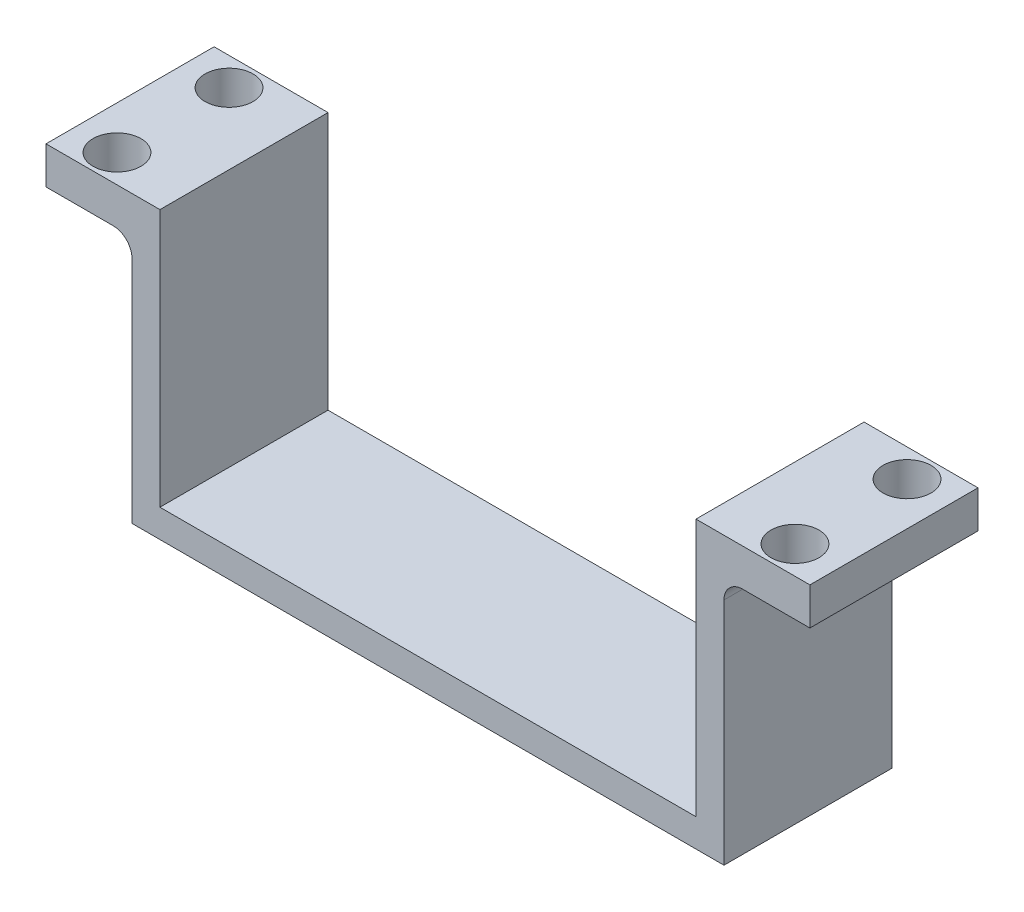
ISO-10303-21;
HEADER;
FILE_DESCRIPTION(('STEP AP214'),'2;1');
FILE_NAME('part.step','',(''),(''),'','','');
FILE_SCHEMA(('AUTOMOTIVE_DESIGN { 1 0 10303 214 1 1 1 1 }'));
ENDSEC;
DATA;
#1=APPLICATION_CONTEXT('core data for automotive mechanical design processes');
#2=APPLICATION_PROTOCOL_DEFINITION('international standard','automotive_design',2000,#1);
#3=PRODUCT_CONTEXT('',#1,'mechanical');
#4=PRODUCT('Part','Part','',(#3));
#5=PRODUCT_RELATED_PRODUCT_CATEGORY('part','',(#4));
#6=PRODUCT_DEFINITION_FORMATION('','',#4);
#7=PRODUCT_DEFINITION_CONTEXT('part definition',#1,'design');
#8=PRODUCT_DEFINITION('design','',#6,#7);
#9=PRODUCT_DEFINITION_SHAPE('','',#8);
#10=(LENGTH_UNIT() NAMED_UNIT(*) SI_UNIT(.MILLI.,.METRE.));
#11=(NAMED_UNIT(*) PLANE_ANGLE_UNIT() SI_UNIT($,.RADIAN.));
#12=(NAMED_UNIT(*) SI_UNIT($,.STERADIAN.) SOLID_ANGLE_UNIT());
#13=UNCERTAINTY_MEASURE_WITH_UNIT(LENGTH_MEASURE(1.E-05),#10,'distance_accuracy_value','');
#14=(GEOMETRIC_REPRESENTATION_CONTEXT(3) GLOBAL_UNCERTAINTY_ASSIGNED_CONTEXT((#13)) GLOBAL_UNIT_ASSIGNED_CONTEXT((#10,
#11,#12)) REPRESENTATION_CONTEXT('',''));
#15=CARTESIAN_POINT('',(0.,0.,0.));
#16=DIRECTION('',(0.,0.,1.));
#17=DIRECTION('',(1.,0.,0.));
#18=AXIS2_PLACEMENT_3D('',#15,#16,#17);
#19=CARTESIAN_POINT('',(-3.81,0.,22.86));
#20=DIRECTION('',(0.,-1.,0.));
#21=DIRECTION('',(0.,0.,-1.));
#22=AXIS2_PLACEMENT_3D('',#19,#20,#21);
#23=PLANE('',#22);
#24=DIRECTION('',(-1.,0.,0.));
#25=VECTOR('',#24,1.);
#26=CARTESIAN_POINT('',(-3.81,0.,0.));
#27=LINE('',#26,#25);
#28=CARTESIAN_POINT('',(0.,0.,0.));
#29=VERTEX_POINT('',#28);
#30=CARTESIAN_POINT('',(-15.494,0.,0.));
#31=VERTEX_POINT('',#30);
#32=EDGE_CURVE('E217',#29,#31,#27,.T.);
#33=ORIENTED_EDGE('',*,*,#32,.T.);
#34=DIRECTION('',(0.,0.,1.));
#35=VECTOR('',#34,1.);
#36=CARTESIAN_POINT('',(-15.494,0.,0.));
#37=LINE('',#36,#35);
#38=CARTESIAN_POINT('',(-15.494,0.,22.86));
#39=VERTEX_POINT('',#38);
#40=EDGE_CURVE('E195',#31,#39,#37,.T.);
#41=ORIENTED_EDGE('',*,*,#40,.T.);
#42=DIRECTION('',(-1.,0.,0.));
#43=VECTOR('',#42,1.);
#44=CARTESIAN_POINT('',(-3.81,0.,22.86));
#45=LINE('',#44,#43);
#46=CARTESIAN_POINT('',(0.,0.,22.86));
#47=VERTEX_POINT('',#46);
#48=EDGE_CURVE('E221',#47,#39,#45,.T.);
#49=ORIENTED_EDGE('',*,*,#48,.F.);
#50=DIRECTION('',(0.,0.,-1.));
#51=VECTOR('',#50,1.);
#52=CARTESIAN_POINT('',(0.,0.,22.86));
#53=LINE('',#52,#51);
#54=EDGE_CURVE('E246',#47,#29,#53,.T.);
#55=ORIENTED_EDGE('',*,*,#54,.T.);
#56=EDGE_LOOP('',(#33,#41,#49,#55));
#57=FACE_BOUND('',#56,.T.);
#58=CARTESIAN_POINT('',(-9.652,0.,19.05));
#59=DIRECTION('',(0.,1.,0.));
#60=DIRECTION('',(0.,0.,1.));
#61=AXIS2_PLACEMENT_3D('',#58,#59,#60);
#62=CIRCLE('',#61,3.26390000000001);
#63=CARTESIAN_POINT('',(-9.652,0.,22.3139));
#64=VERTEX_POINT('',#63);
#65=EDGE_CURVE('E181',#64,#64,#62,.T.);
#66=ORIENTED_EDGE('',*,*,#65,.F.);
#67=EDGE_LOOP('',(#66));
#68=FACE_BOUND('',#67,.T.);
#69=CARTESIAN_POINT('',(-9.652,0.,3.81));
#70=DIRECTION('',(0.,1.,0.));
#71=DIRECTION('',(0.,0.,1.));
#72=AXIS2_PLACEMENT_3D('',#69,#70,#71);
#73=CIRCLE('',#72,3.2639);
#74=CARTESIAN_POINT('',(-9.652,0.,7.0739));
#75=VERTEX_POINT('',#74);
#76=EDGE_CURVE('E187',#75,#75,#73,.T.);
#77=ORIENTED_EDGE('',*,*,#76,.F.);
#78=EDGE_LOOP('',(#77));
#79=FACE_BOUND('',#78,.T.);
#80=ADVANCED_FACE('F42',(#57,#68,#79),#23,.F.);
#81=CARTESIAN_POINT('',(-3.81,-38.862,22.86));
#82=DIRECTION('',(1.,0.,0.));
#83=DIRECTION('',(0.,1.,0.));
#84=AXIS2_PLACEMENT_3D('',#81,#82,#83);
#85=PLANE('',#84);
#86=DIRECTION('',(0.,-1.,0.));
#87=VECTOR('',#86,1.);
#88=CARTESIAN_POINT('',(-3.81,-38.862,22.86));
#89=LINE('',#88,#87);
#90=CARTESIAN_POINT('',(-3.81,-7.62000000000001,22.86));
#91=VERTEX_POINT('',#90);
#92=CARTESIAN_POINT('',(-3.81,-38.862,22.86));
#93=VERTEX_POINT('',#92);
#94=EDGE_CURVE('E224',#91,#93,#89,.T.);
#95=ORIENTED_EDGE('',*,*,#94,.F.);
#96=DIRECTION('',(0.,0.,-1.));
#97=VECTOR('',#96,1.);
#98=CARTESIAN_POINT('',(-3.81,-7.62,22.86));
#99=LINE('',#98,#97);
#100=CARTESIAN_POINT('',(-3.81,-7.62000000000001,0.));
#101=VERTEX_POINT('',#100);
#102=EDGE_CURVE('E300',#91,#101,#99,.T.);
#103=ORIENTED_EDGE('',*,*,#102,.T.);
#104=DIRECTION('',(0.,-1.,0.));
#105=VECTOR('',#104,1.);
#106=CARTESIAN_POINT('',(-3.81,-38.862,0.));
#107=LINE('',#106,#105);
#108=CARTESIAN_POINT('',(-3.81,-38.862,0.));
#109=VERTEX_POINT('',#108);
#110=EDGE_CURVE('E249',#101,#109,#107,.T.);
#111=ORIENTED_EDGE('',*,*,#110,.T.);
#112=DIRECTION('',(0.,0.,-1.));
#113=VECTOR('',#112,1.);
#114=CARTESIAN_POINT('',(-3.81,-38.862,22.86));
#115=LINE('',#114,#113);
#116=EDGE_CURVE('E289',#93,#109,#115,.T.);
#117=ORIENTED_EDGE('',*,*,#116,.F.);
#118=EDGE_LOOP('',(#95,#103,#111,#117));
#119=FACE_BOUND('',#118,.T.);
#120=ADVANCED_FACE('F335',(#119),#85,.F.);
#121=CARTESIAN_POINT('',(76.708,-38.862,22.86));
#122=DIRECTION('',(0.,1.,0.));
#123=DIRECTION('',(-1.,0.,0.));
#124=AXIS2_PLACEMENT_3D('',#121,#122,#123);
#125=PLANE('',#124);
#126=DIRECTION('',(1.,0.,0.));
#127=VECTOR('',#126,1.);
#128=CARTESIAN_POINT('',(76.708,-38.862,0.));
#129=LINE('',#128,#127);
#130=CARTESIAN_POINT('',(76.708,-38.862,0.));
#131=VERTEX_POINT('',#130);
#132=EDGE_CURVE('E252',#109,#131,#129,.T.);
#133=ORIENTED_EDGE('',*,*,#132,.T.);
#134=DIRECTION('',(0.,0.,-1.));
#135=VECTOR('',#134,1.);
#136=CARTESIAN_POINT('',(76.708,-38.862,22.86));
#137=LINE('',#136,#135);
#138=CARTESIAN_POINT('',(76.708,-38.862,22.86));
#139=VERTEX_POINT('',#138);
#140=EDGE_CURVE('E285',#139,#131,#137,.T.);
#141=ORIENTED_EDGE('',*,*,#140,.F.);
#142=DIRECTION('',(1.,0.,0.));
#143=VECTOR('',#142,1.);
#144=CARTESIAN_POINT('',(76.708,-38.862,22.86));
#145=LINE('',#144,#143);
#146=EDGE_CURVE('E228',#93,#139,#145,.T.);
#147=ORIENTED_EDGE('',*,*,#146,.F.);
#148=ORIENTED_EDGE('',*,*,#116,.T.);
#149=EDGE_LOOP('',(#133,#141,#147,#148));
#150=FACE_BOUND('',#149,.T.);
#151=ADVANCED_FACE('F341',(#150),#125,.F.);
#152=CARTESIAN_POINT('',(76.708,0.,22.86));
#153=DIRECTION('',(-1.,0.,0.));
#154=DIRECTION('',(0.,0.,1.));
#155=AXIS2_PLACEMENT_3D('',#152,#153,#154);
#156=PLANE('',#155);
#157=DIRECTION('',(0.,1.,0.));
#158=VECTOR('',#157,1.);
#159=CARTESIAN_POINT('',(76.708,0.,0.));
#160=LINE('',#159,#158);
#161=CARTESIAN_POINT('',(76.708,-7.62,0.));
#162=VERTEX_POINT('',#161);
#163=EDGE_CURVE('E255',#131,#162,#160,.T.);
#164=ORIENTED_EDGE('',*,*,#163,.T.);
#165=DIRECTION('',(0.,0.,1.));
#166=VECTOR('',#165,1.);
#167=CARTESIAN_POINT('',(76.708,-7.62,22.86));
#168=LINE('',#167,#166);
#169=CARTESIAN_POINT('',(76.708,-7.62,22.86));
#170=VERTEX_POINT('',#169);
#171=EDGE_CURVE('E293',#162,#170,#168,.T.);
#172=ORIENTED_EDGE('',*,*,#171,.T.);
#173=DIRECTION('',(0.,1.,0.));
#174=VECTOR('',#173,1.);
#175=CARTESIAN_POINT('',(76.708,0.,22.86));
#176=LINE('',#175,#174);
#177=EDGE_CURVE('E231',#139,#170,#176,.T.);
#178=ORIENTED_EDGE('',*,*,#177,.F.);
#179=ORIENTED_EDGE('',*,*,#140,.T.);
#180=EDGE_LOOP('',(#164,#172,#178,#179));
#181=FACE_BOUND('',#180,.T.);
#182=ADVANCED_FACE('F319',(#181),#156,.F.);
#183=CARTESIAN_POINT('',(72.898,0.,22.86));
#184=DIRECTION('',(0.,-1.,0.));
#185=DIRECTION('',(0.,0.,-1.));
#186=AXIS2_PLACEMENT_3D('',#183,#184,#185);
#187=PLANE('',#186);
#188=DIRECTION('',(-1.,0.,0.));
#189=VECTOR('',#188,1.);
#190=CARTESIAN_POINT('',(72.898,0.,0.));
#191=LINE('',#190,#189);
#192=CARTESIAN_POINT('',(88.392,0.,0.));
#193=VERTEX_POINT('',#192);
#194=CARTESIAN_POINT('',(72.898,0.,0.));
#195=VERTEX_POINT('',#194);
#196=EDGE_CURVE('E259',#193,#195,#191,.T.);
#197=ORIENTED_EDGE('',*,*,#196,.T.);
#198=DIRECTION('',(0.,0.,-1.));
#199=VECTOR('',#198,1.);
#200=CARTESIAN_POINT('',(72.898,0.,22.86));
#201=LINE('',#200,#199);
#202=CARTESIAN_POINT('',(72.898,0.,22.86));
#203=VERTEX_POINT('',#202);
#204=EDGE_CURVE('E281',#203,#195,#201,.T.);
#205=ORIENTED_EDGE('',*,*,#204,.F.);
#206=DIRECTION('',(-1.,0.,0.));
#207=VECTOR('',#206,1.);
#208=CARTESIAN_POINT('',(72.898,0.,22.86));
#209=LINE('',#208,#207);
#210=CARTESIAN_POINT('',(88.392,0.,22.86));
#211=VERTEX_POINT('',#210);
#212=EDGE_CURVE('E234',#211,#203,#209,.T.);
#213=ORIENTED_EDGE('',*,*,#212,.F.);
#214=DIRECTION('',(0.,0.,1.));
#215=VECTOR('',#214,1.);
#216=CARTESIAN_POINT('',(88.392,0.,0.));
#217=LINE('',#216,#215);
#218=EDGE_CURVE('E161',#193,#211,#217,.T.);
#219=ORIENTED_EDGE('',*,*,#218,.F.);
#220=EDGE_LOOP('',(#197,#205,#213,#219));
#221=FACE_BOUND('',#220,.T.);
#222=CARTESIAN_POINT('',(82.55,0.,3.81));
#223=DIRECTION('',(0.,-1.,0.));
#224=DIRECTION('',(0.,0.,1.));
#225=AXIS2_PLACEMENT_3D('',#222,#223,#224);
#226=CIRCLE('',#225,3.2639);
#227=CARTESIAN_POINT('',(82.55,0.,7.0739));
#228=VERTEX_POINT('',#227);
#229=EDGE_CURVE('E175',#228,#228,#226,.T.);
#230=ORIENTED_EDGE('',*,*,#229,.T.);
#231=EDGE_LOOP('',(#230));
#232=FACE_BOUND('',#231,.T.);
#233=CARTESIAN_POINT('',(82.55,0.,19.05));
#234=DIRECTION('',(0.,-1.,0.));
#235=DIRECTION('',(0.,0.,1.));
#236=AXIS2_PLACEMENT_3D('',#233,#234,#235);
#237=CIRCLE('',#236,3.26390000000001);
#238=CARTESIAN_POINT('',(82.55,0.,22.3139));
#239=VERTEX_POINT('',#238);
#240=EDGE_CURVE('E407',#239,#239,#237,.T.);
#241=ORIENTED_EDGE('',*,*,#240,.T.);
#242=EDGE_LOOP('',(#241));
#243=FACE_BOUND('',#242,.T.);
#244=ADVANCED_FACE('F351',(#221,#232,#243),#187,.F.);
#245=CARTESIAN_POINT('',(72.898,-35.052,22.86));
#246=DIRECTION('',(1.,0.,0.));
#247=DIRECTION('',(0.,0.,-1.));
#248=AXIS2_PLACEMENT_3D('',#245,#246,#247);
#249=PLANE('',#248);
#250=DIRECTION('',(0.,0.,-1.));
#251=VECTOR('',#250,1.);
#252=CARTESIAN_POINT('',(72.898,-35.052,22.86));
#253=LINE('',#252,#251);
#254=CARTESIAN_POINT('',(72.898,-35.052,22.86));
#255=VERTEX_POINT('',#254);
#256=CARTESIAN_POINT('',(72.898,-35.052,0.));
#257=VERTEX_POINT('',#256);
#258=EDGE_CURVE('E277',#255,#257,#253,.T.);
#259=ORIENTED_EDGE('',*,*,#258,.F.);
#260=DIRECTION('',(0.,-1.,0.));
#261=VECTOR('',#260,1.);
#262=CARTESIAN_POINT('',(72.898,-35.052,22.86));
#263=LINE('',#262,#261);
#264=EDGE_CURVE('E237',#203,#255,#263,.T.);
#265=ORIENTED_EDGE('',*,*,#264,.F.);
#266=ORIENTED_EDGE('',*,*,#204,.T.);
#267=DIRECTION('',(0.,-1.,0.));
#268=VECTOR('',#267,1.);
#269=CARTESIAN_POINT('',(72.898,-35.052,0.));
#270=LINE('',#269,#268);
#271=EDGE_CURVE('E262',#195,#257,#270,.T.);
#272=ORIENTED_EDGE('',*,*,#271,.T.);
#273=EDGE_LOOP('',(#259,#265,#266,#272));
#274=FACE_BOUND('',#273,.T.);
#275=ADVANCED_FACE('F354',(#274),#249,.F.);
#276=CARTESIAN_POINT('',(0.,-35.052,22.86));
#277=DIRECTION('',(0.,-1.,0.));
#278=DIRECTION('',(0.,0.,-1.));
#279=AXIS2_PLACEMENT_3D('',#276,#277,#278);
#280=PLANE('',#279);
#281=DIRECTION('',(-1.,0.,0.));
#282=VECTOR('',#281,1.);
#283=CARTESIAN_POINT('',(0.,-35.052,0.));
#284=LINE('',#283,#282);
#285=CARTESIAN_POINT('',(0.,-35.052,0.));
#286=VERTEX_POINT('',#285);
#287=EDGE_CURVE('E265',#257,#286,#284,.T.);
#288=ORIENTED_EDGE('',*,*,#287,.T.);
#289=DIRECTION('',(0.,0.,-1.));
#290=VECTOR('',#289,1.);
#291=CARTESIAN_POINT('',(0.,-35.052,22.86));
#292=LINE('',#291,#290);
#293=CARTESIAN_POINT('',(0.,-35.052,22.86));
#294=VERTEX_POINT('',#293);
#295=EDGE_CURVE('E273',#294,#286,#292,.T.);
#296=ORIENTED_EDGE('',*,*,#295,.F.);
#297=DIRECTION('',(-1.,0.,0.));
#298=VECTOR('',#297,1.);
#299=CARTESIAN_POINT('',(0.,-35.052,22.86));
#300=LINE('',#299,#298);
#301=EDGE_CURVE('E240',#255,#294,#300,.T.);
#302=ORIENTED_EDGE('',*,*,#301,.F.);
#303=ORIENTED_EDGE('',*,*,#258,.T.);
#304=EDGE_LOOP('',(#288,#296,#302,#303));
#305=FACE_BOUND('',#304,.T.);
#306=ADVANCED_FACE('F358',(#305),#280,.F.);
#307=CARTESIAN_POINT('',(0.,0.,22.86));
#308=DIRECTION('',(-1.,0.,0.));
#309=DIRECTION('',(0.,0.,1.));
#310=AXIS2_PLACEMENT_3D('',#307,#308,#309);
#311=PLANE('',#310);
#312=DIRECTION('',(0.,1.,0.));
#313=VECTOR('',#312,1.);
#314=CARTESIAN_POINT('',(0.,0.,0.));
#315=LINE('',#314,#313);
#316=EDGE_CURVE('E225',#286,#29,#315,.T.);
#317=ORIENTED_EDGE('',*,*,#316,.T.);
#318=ORIENTED_EDGE('',*,*,#54,.F.);
#319=DIRECTION('',(0.,1.,0.));
#320=VECTOR('',#319,1.);
#321=CARTESIAN_POINT('',(0.,0.,22.86));
#322=LINE('',#321,#320);
#323=EDGE_CURVE('E243',#294,#47,#322,.T.);
#324=ORIENTED_EDGE('',*,*,#323,.F.);
#325=ORIENTED_EDGE('',*,*,#295,.T.);
#326=EDGE_LOOP('',(#317,#318,#324,#325));
#327=FACE_BOUND('',#326,.T.);
#328=ADVANCED_FACE('F362',(#327),#311,.F.);
#329=CARTESIAN_POINT('',(0.,0.,22.86));
#330=DIRECTION('',(0.,0.,-1.));
#331=DIRECTION('',(-1.,0.,0.));
#332=AXIS2_PLACEMENT_3D('',#329,#330,#331);
#333=PLANE('',#332);
#334=ORIENTED_EDGE('',*,*,#177,.T.);
#335=CARTESIAN_POINT('',(79.248,-7.62,22.86));
#336=DIRECTION('',(0.,0.,-1.));
#337=DIRECTION('',(-1.,0.,0.));
#338=AXIS2_PLACEMENT_3D('',#335,#336,#337);
#339=CIRCLE('',#338,2.54);
#340=CARTESIAN_POINT('',(79.248,-5.08,22.86));
#341=VERTEX_POINT('',#340);
#342=EDGE_CURVE('E168',#170,#341,#339,.T.);
#343=ORIENTED_EDGE('',*,*,#342,.T.);
#344=DIRECTION('',(-1.,0.,0.));
#345=VECTOR('',#344,1.);
#346=CARTESIAN_POINT('',(72.898,-5.08,22.86));
#347=LINE('',#346,#345);
#348=CARTESIAN_POINT('',(88.392,-5.08,22.86));
#349=VERTEX_POINT('',#348);
#350=EDGE_CURVE('E147',#349,#341,#347,.T.);
#351=ORIENTED_EDGE('',*,*,#350,.F.);
#352=DIRECTION('',(0.,1.,0.));
#353=VECTOR('',#352,1.);
#354=CARTESIAN_POINT('',(88.392,-5.08,22.86));
#355=LINE('',#354,#353);
#356=EDGE_CURVE('E158',#349,#211,#355,.T.);
#357=ORIENTED_EDGE('',*,*,#356,.T.);
#358=ORIENTED_EDGE('',*,*,#212,.T.);
#359=ORIENTED_EDGE('',*,*,#264,.T.);
#360=ORIENTED_EDGE('',*,*,#301,.T.);
#361=ORIENTED_EDGE('',*,*,#323,.T.);
#362=ORIENTED_EDGE('',*,*,#48,.T.);
#363=DIRECTION('',(0.,1.,0.));
#364=VECTOR('',#363,1.);
#365=CARTESIAN_POINT('',(-15.494,-5.08,22.86));
#366=LINE('',#365,#364);
#367=CARTESIAN_POINT('',(-15.494,-5.08,22.86));
#368=VERTEX_POINT('',#367);
#369=EDGE_CURVE('E213',#368,#39,#366,.T.);
#370=ORIENTED_EDGE('',*,*,#369,.F.);
#371=DIRECTION('',(1.,0.,0.));
#372=VECTOR('',#371,1.);
#373=CARTESIAN_POINT('',(0.,-5.08,22.86));
#374=LINE('',#373,#372);
#375=CARTESIAN_POINT('',(-6.35,-5.08,22.86));
#376=VERTEX_POINT('',#375);
#377=EDGE_CURVE('E206',#368,#376,#374,.T.);
#378=ORIENTED_EDGE('',*,*,#377,.T.);
#379=CARTESIAN_POINT('',(-6.35,-7.62,22.86));
#380=DIRECTION('',(0.,0.,-1.));
#381=DIRECTION('',(-1.,0.,0.));
#382=AXIS2_PLACEMENT_3D('',#379,#380,#381);
#383=CIRCLE('',#382,2.54);
#384=EDGE_CURVE('E11',#376,#91,#383,.T.);
#385=ORIENTED_EDGE('',*,*,#384,.T.);
#386=ORIENTED_EDGE('',*,*,#94,.T.);
#387=ORIENTED_EDGE('',*,*,#146,.T.);
#388=EDGE_LOOP('',(#334,#343,#351,#357,#358,#359,#360,#361,#362,#370,#378,#385,#386,#387));
#389=FACE_BOUND('',#388,.T.);
#390=ADVANCED_FACE('F167',(#389),#333,.F.);
#391=CARTESIAN_POINT('',(0.,0.,0.));
#392=DIRECTION('',(0.,0.,-1.));
#393=DIRECTION('',(-1.,0.,0.));
#394=AXIS2_PLACEMENT_3D('',#391,#392,#393);
#395=PLANE('',#394);
#396=ORIENTED_EDGE('',*,*,#287,.F.);
#397=ORIENTED_EDGE('',*,*,#271,.F.);
#398=ORIENTED_EDGE('',*,*,#196,.F.);
#399=DIRECTION('',(0.,1.,0.));
#400=VECTOR('',#399,1.);
#401=CARTESIAN_POINT('',(88.392,-5.08,0.));
#402=LINE('',#401,#400);
#403=CARTESIAN_POINT('',(88.392,-5.08,0.));
#404=VERTEX_POINT('',#403);
#405=EDGE_CURVE('E164',#404,#193,#402,.T.);
#406=ORIENTED_EDGE('',*,*,#405,.F.);
#407=DIRECTION('',(1.,0.,0.));
#408=VECTOR('',#407,1.);
#409=CARTESIAN_POINT('',(72.898,-5.08,0.));
#410=LINE('',#409,#408);
#411=CARTESIAN_POINT('',(79.248,-5.08,0.));
#412=VERTEX_POINT('',#411);
#413=EDGE_CURVE('E150',#412,#404,#410,.T.);
#414=ORIENTED_EDGE('',*,*,#413,.F.);
#415=CARTESIAN_POINT('',(79.248,-7.62,0.));
#416=DIRECTION('',(0.,0.,-1.));
#417=DIRECTION('',(-1.,0.,0.));
#418=AXIS2_PLACEMENT_3D('',#415,#416,#417);
#419=CIRCLE('',#418,2.54);
#420=EDGE_CURVE('E308',#412,#162,#419,.F.);
#421=ORIENTED_EDGE('',*,*,#420,.T.);
#422=ORIENTED_EDGE('',*,*,#163,.F.);
#423=ORIENTED_EDGE('',*,*,#132,.F.);
#424=ORIENTED_EDGE('',*,*,#110,.F.);
#425=CARTESIAN_POINT('',(-6.35,-7.62,0.));
#426=DIRECTION('',(0.,0.,-1.));
#427=DIRECTION('',(-1.,0.,0.));
#428=AXIS2_PLACEMENT_3D('',#425,#426,#427);
#429=CIRCLE('',#428,2.54);
#430=CARTESIAN_POINT('',(-6.35,-5.08,0.));
#431=VERTEX_POINT('',#430);
#432=EDGE_CURVE('E51',#101,#431,#429,.F.);
#433=ORIENTED_EDGE('',*,*,#432,.T.);
#434=DIRECTION('',(-1.,0.,0.));
#435=VECTOR('',#434,1.);
#436=CARTESIAN_POINT('',(0.,-5.08,0.));
#437=LINE('',#436,#435);
#438=CARTESIAN_POINT('',(-15.494,-5.08,0.));
#439=VERTEX_POINT('',#438);
#440=EDGE_CURVE('E199',#431,#439,#437,.T.);
#441=ORIENTED_EDGE('',*,*,#440,.T.);
#442=DIRECTION('',(0.,1.,0.));
#443=VECTOR('',#442,1.);
#444=CARTESIAN_POINT('',(-15.494,-5.08,0.));
#445=LINE('',#444,#443);
#446=EDGE_CURVE('E209',#439,#31,#445,.T.);
#447=ORIENTED_EDGE('',*,*,#446,.T.);
#448=ORIENTED_EDGE('',*,*,#32,.F.);
#449=ORIENTED_EDGE('',*,*,#316,.F.);
#450=EDGE_LOOP('',(#396,#397,#398,#406,#414,#421,#422,#423,#424,#433,#441,#447,#448,#449));
#451=FACE_BOUND('',#450,.T.);
#452=ADVANCED_FACE('F314',(#451),#395,.T.);
#453=CARTESIAN_POINT('',(0.,-5.08,0.));
#454=DIRECTION('',(0.,-1.,0.));
#455=DIRECTION('',(0.,0.,-1.));
#456=AXIS2_PLACEMENT_3D('',#453,#454,#455);
#457=PLANE('',#456);
#458=CARTESIAN_POINT('',(-9.652,-5.08,3.81));
#459=DIRECTION('',(0.,1.,0.));
#460=DIRECTION('',(0.,0.,1.));
#461=AXIS2_PLACEMENT_3D('',#458,#459,#460);
#462=CIRCLE('',#461,3.2639);
#463=CARTESIAN_POINT('',(-9.652,-5.08,7.0739));
#464=VERTEX_POINT('',#463);
#465=EDGE_CURVE('E191',#464,#464,#462,.T.);
#466=ORIENTED_EDGE('',*,*,#465,.T.);
#467=EDGE_LOOP('',(#466));
#468=FACE_BOUND('',#467,.T.);
#469=CARTESIAN_POINT('',(-9.652,-5.08,19.05));
#470=DIRECTION('',(0.,1.,0.));
#471=DIRECTION('',(0.,0.,1.));
#472=AXIS2_PLACEMENT_3D('',#469,#470,#471);
#473=CIRCLE('',#472,3.26390000000001);
#474=CARTESIAN_POINT('',(-9.652,-5.08,22.3139));
#475=VERTEX_POINT('',#474);
#476=EDGE_CURVE('E183',#475,#475,#473,.T.);
#477=ORIENTED_EDGE('',*,*,#476,.T.);
#478=EDGE_LOOP('',(#477));
#479=FACE_BOUND('',#478,.T.);
#480=ORIENTED_EDGE('',*,*,#440,.F.);
#481=DIRECTION('',(0.,0.,-1.));
#482=VECTOR('',#481,1.);
#483=CARTESIAN_POINT('',(-6.35,-5.08,0.));
#484=LINE('',#483,#482);
#485=EDGE_CURVE('E64',#431,#376,#484,.F.);
#486=ORIENTED_EDGE('',*,*,#485,.T.);
#487=ORIENTED_EDGE('',*,*,#377,.F.);
#488=DIRECTION('',(0.,0.,1.));
#489=VECTOR('',#488,1.);
#490=CARTESIAN_POINT('',(-15.494,-5.08,0.));
#491=LINE('',#490,#489);
#492=EDGE_CURVE('E202',#439,#368,#491,.T.);
#493=ORIENTED_EDGE('',*,*,#492,.F.);
#494=EDGE_LOOP('',(#480,#486,#487,#493));
#495=FACE_BOUND('',#494,.T.);
#496=ADVANCED_FACE('F369',(#468,#479,#495),#457,.T.);
#497=CARTESIAN_POINT('',(-15.494,-5.08,0.));
#498=DIRECTION('',(-1.,0.,0.));
#499=DIRECTION('',(0.,0.,1.));
#500=AXIS2_PLACEMENT_3D('',#497,#498,#499);
#501=PLANE('',#500);
#502=ORIENTED_EDGE('',*,*,#40,.F.);
#503=ORIENTED_EDGE('',*,*,#446,.F.);
#504=ORIENTED_EDGE('',*,*,#492,.T.);
#505=ORIENTED_EDGE('',*,*,#369,.T.);
#506=EDGE_LOOP('',(#502,#503,#504,#505));
#507=FACE_BOUND('',#506,.T.);
#508=ADVANCED_FACE('F372',(#507),#501,.T.);
#509=CARTESIAN_POINT('',(-9.652,-5.08,3.81));
#510=DIRECTION('',(0.,1.,0.));
#511=DIRECTION('',(0.,0.,1.));
#512=AXIS2_PLACEMENT_3D('',#509,#510,#511);
#513=CYLINDRICAL_SURFACE('',#512,3.2639);
#514=ORIENTED_EDGE('',*,*,#465,.F.);
#515=EDGE_LOOP('',(#514));
#516=FACE_BOUND('',#515,.T.);
#517=ORIENTED_EDGE('',*,*,#76,.T.);
#518=EDGE_LOOP('',(#517));
#519=FACE_BOUND('',#518,.T.);
#520=ADVANCED_FACE('F375',(#516,#519),#513,.F.);
#521=CARTESIAN_POINT('',(-9.652,-5.08,19.05));
#522=DIRECTION('',(0.,1.,0.));
#523=DIRECTION('',(0.,0.,1.));
#524=AXIS2_PLACEMENT_3D('',#521,#522,#523);
#525=CYLINDRICAL_SURFACE('',#524,3.26390000000001);
#526=ORIENTED_EDGE('',*,*,#476,.F.);
#527=EDGE_LOOP('',(#526));
#528=FACE_BOUND('',#527,.T.);
#529=ORIENTED_EDGE('',*,*,#65,.T.);
#530=EDGE_LOOP('',(#529));
#531=FACE_BOUND('',#530,.T.);
#532=ADVANCED_FACE('F382',(#528,#531),#525,.F.);
#533=CARTESIAN_POINT('',(72.898,-5.08,0.));
#534=DIRECTION('',(0.,-1.,0.));
#535=DIRECTION('',(0.,0.,-1.));
#536=AXIS2_PLACEMENT_3D('',#533,#534,#535);
#537=PLANE('',#536);
#538=CARTESIAN_POINT('',(82.55,-5.08,19.05));
#539=DIRECTION('',(0.,-1.,0.));
#540=DIRECTION('',(0.,0.,1.));
#541=AXIS2_PLACEMENT_3D('',#538,#539,#540);
#542=CIRCLE('',#541,3.26390000000001);
#543=CARTESIAN_POINT('',(82.55,-5.08,22.3139));
#544=VERTEX_POINT('',#543);
#545=EDGE_CURVE('E403',#544,#544,#542,.T.);
#546=ORIENTED_EDGE('',*,*,#545,.F.);
#547=EDGE_LOOP('',(#546));
#548=FACE_BOUND('',#547,.T.);
#549=CARTESIAN_POINT('',(82.55,-5.08,3.81));
#550=DIRECTION('',(0.,-1.,0.));
#551=DIRECTION('',(0.,0.,1.));
#552=AXIS2_PLACEMENT_3D('',#549,#550,#551);
#553=CIRCLE('',#552,3.2639);
#554=CARTESIAN_POINT('',(82.55,-5.08,7.0739));
#555=VERTEX_POINT('',#554);
#556=EDGE_CURVE('E172',#555,#555,#553,.T.);
#557=ORIENTED_EDGE('',*,*,#556,.F.);
#558=EDGE_LOOP('',(#557));
#559=FACE_BOUND('',#558,.T.);
#560=ORIENTED_EDGE('',*,*,#350,.T.);
#561=DIRECTION('',(0.,0.,1.));
#562=VECTOR('',#561,1.);
#563=CARTESIAN_POINT('',(79.248,-5.08,0.));
#564=LINE('',#563,#562);
#565=EDGE_CURVE('E297',#341,#412,#564,.F.);
#566=ORIENTED_EDGE('',*,*,#565,.T.);
#567=ORIENTED_EDGE('',*,*,#413,.T.);
#568=DIRECTION('',(0.,0.,1.));
#569=VECTOR('',#568,1.);
#570=CARTESIAN_POINT('',(88.392,-5.08,0.));
#571=LINE('',#570,#569);
#572=EDGE_CURVE('E143',#404,#349,#571,.T.);
#573=ORIENTED_EDGE('',*,*,#572,.T.);
#574=EDGE_LOOP('',(#560,#566,#567,#573));
#575=FACE_BOUND('',#574,.T.);
#576=ADVANCED_FACE('F145',(#548,#559,#575),#537,.T.);
#577=CARTESIAN_POINT('',(88.392,-5.08,0.));
#578=DIRECTION('',(-1.,0.,0.));
#579=DIRECTION('',(0.,0.,1.));
#580=AXIS2_PLACEMENT_3D('',#577,#578,#579);
#581=PLANE('',#580);
#582=ORIENTED_EDGE('',*,*,#218,.T.);
#583=ORIENTED_EDGE('',*,*,#356,.F.);
#584=ORIENTED_EDGE('',*,*,#572,.F.);
#585=ORIENTED_EDGE('',*,*,#405,.T.);
#586=EDGE_LOOP('',(#582,#583,#584,#585));
#587=FACE_BOUND('',#586,.T.);
#588=ADVANCED_FACE('F159',(#587),#581,.F.);
#589=CARTESIAN_POINT('',(82.55,-5.08,3.81));
#590=DIRECTION('',(0.,1.,0.));
#591=DIRECTION('',(0.,0.,1.));
#592=AXIS2_PLACEMENT_3D('',#589,#590,#591);
#593=CYLINDRICAL_SURFACE('',#592,3.2639);
#594=ORIENTED_EDGE('',*,*,#556,.T.);
#595=EDGE_LOOP('',(#594));
#596=FACE_BOUND('',#595,.T.);
#597=ORIENTED_EDGE('',*,*,#229,.F.);
#598=EDGE_LOOP('',(#597));
#599=FACE_BOUND('',#598,.T.);
#600=ADVANCED_FACE('F330',(#596,#599),#593,.F.);
#601=CARTESIAN_POINT('',(82.55,-5.08,19.05));
#602=DIRECTION('',(0.,1.,0.));
#603=DIRECTION('',(0.,0.,1.));
#604=AXIS2_PLACEMENT_3D('',#601,#602,#603);
#605=CYLINDRICAL_SURFACE('',#604,3.26390000000001);
#606=ORIENTED_EDGE('',*,*,#545,.T.);
#607=EDGE_LOOP('',(#606));
#608=FACE_BOUND('',#607,.T.);
#609=ORIENTED_EDGE('',*,*,#240,.F.);
#610=EDGE_LOOP('',(#609));
#611=FACE_BOUND('',#610,.T.);
#612=ADVANCED_FACE('F324',(#608,#611),#605,.F.);
#613=CARTESIAN_POINT('',(79.248,-7.62,22.86));
#614=DIRECTION('',(0.,0.,1.));
#615=DIRECTION('',(1.,0.,0.));
#616=AXIS2_PLACEMENT_3D('',#613,#614,#615);
#617=CYLINDRICAL_SURFACE('',#616,2.54);
#618=ORIENTED_EDGE('',*,*,#420,.F.);
#619=ORIENTED_EDGE('',*,*,#565,.F.);
#620=ORIENTED_EDGE('',*,*,#342,.F.);
#621=ORIENTED_EDGE('',*,*,#171,.F.);
#622=EDGE_LOOP('',(#618,#619,#620,#621));
#623=FACE_BOUND('',#622,.T.);
#624=ADVANCED_FACE('F322',(#623),#617,.F.);
#625=CARTESIAN_POINT('',(-6.35,-7.62,22.86));
#626=DIRECTION('',(0.,0.,-1.));
#627=DIRECTION('',(-1.,0.,0.));
#628=AXIS2_PLACEMENT_3D('',#625,#626,#627);
#629=CYLINDRICAL_SURFACE('',#628,2.54);
#630=ORIENTED_EDGE('',*,*,#384,.F.);
#631=ORIENTED_EDGE('',*,*,#485,.F.);
#632=ORIENTED_EDGE('',*,*,#432,.F.);
#633=ORIENTED_EDGE('',*,*,#102,.F.);
#634=EDGE_LOOP('',(#630,#631,#632,#633));
#635=FACE_BOUND('',#634,.T.);
#636=ADVANCED_FACE('F44',(#635),#629,.F.);
#637=CLOSED_SHELL('',(#80,#120,#151,#182,#244,#275,#306,#328,#390,#452,#496,#508,#520,#532,#576,
#588,#600,#612,#624,#636));
#638=MANIFOLD_SOLID_BREP('B2',#637);
#639=ADVANCED_BREP_SHAPE_REPRESENTATION('',(#18,#638),#14);
#640=SHAPE_DEFINITION_REPRESENTATION(#9,#639);
ENDSEC;
END-ISO-10303-21;
